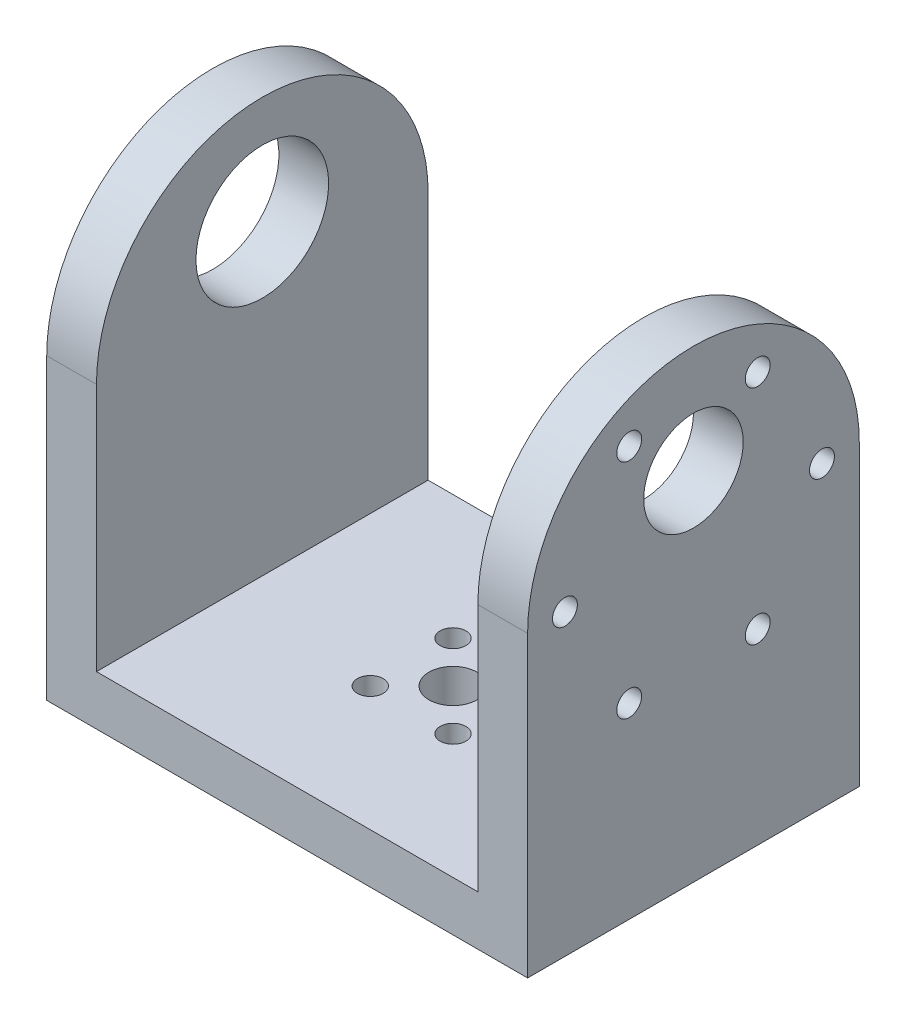
ISO-10303-21;
HEADER;
FILE_DESCRIPTION(('STEP AP214'),'2;1');
FILE_NAME('part.step','',(''),(''),'','','');
FILE_SCHEMA(('AUTOMOTIVE_DESIGN { 1 0 10303 214 1 1 1 1 }'));
ENDSEC;
DATA;
#1=APPLICATION_CONTEXT('core data for automotive mechanical design processes');
#2=APPLICATION_PROTOCOL_DEFINITION('international standard','automotive_design',2000,#1);
#3=PRODUCT_CONTEXT('',#1,'mechanical');
#4=PRODUCT('Part','Part','',(#3));
#5=PRODUCT_RELATED_PRODUCT_CATEGORY('part','',(#4));
#6=PRODUCT_DEFINITION_FORMATION('','',#4);
#7=PRODUCT_DEFINITION_CONTEXT('part definition',#1,'design');
#8=PRODUCT_DEFINITION('design','',#6,#7);
#9=PRODUCT_DEFINITION_SHAPE('','',#8);
#10=(LENGTH_UNIT() NAMED_UNIT(*) SI_UNIT(.MILLI.,.METRE.));
#11=(NAMED_UNIT(*) PLANE_ANGLE_UNIT() SI_UNIT($,.RADIAN.));
#12=(NAMED_UNIT(*) SI_UNIT($,.STERADIAN.) SOLID_ANGLE_UNIT());
#13=UNCERTAINTY_MEASURE_WITH_UNIT(LENGTH_MEASURE(1.E-05),#10,'distance_accuracy_value','');
#14=(GEOMETRIC_REPRESENTATION_CONTEXT(3) GLOBAL_UNCERTAINTY_ASSIGNED_CONTEXT((#13)) GLOBAL_UNIT_ASSIGNED_CONTEXT((#10,
#11,#12)) REPRESENTATION_CONTEXT('',''));
#15=CARTESIAN_POINT('',(0.,0.,0.));
#16=DIRECTION('',(0.,0.,1.));
#17=DIRECTION('',(1.,0.,0.));
#18=AXIS2_PLACEMENT_3D('',#15,#16,#17);
#19=CARTESIAN_POINT('',(0.,2.,0.));
#20=DIRECTION('',(0.,1.,0.));
#21=DIRECTION('',(0.,0.,1.));
#22=AXIS2_PLACEMENT_3D('',#19,#20,#21);
#23=PLANE('',#22);
#24=CARTESIAN_POINT('',(8.49,2.,-36.5807801762255));
#25=DIRECTION('',(0.,1.,0.));
#26=DIRECTION('',(0.,0.,1.));
#27=AXIS2_PLACEMENT_3D('',#24,#25,#26);
#28=CIRCLE('',#27,1.55);
#29=CARTESIAN_POINT('',(8.49,2.,-35.0307801762255));
#30=VERTEX_POINT('',#29);
#31=EDGE_CURVE('E136',#30,#30,#28,.T.);
#32=ORIENTED_EDGE('',*,*,#31,.F.);
#33=EDGE_LOOP('',(#32));
#34=FACE_BOUND('',#33,.T.);
#35=CARTESIAN_POINT('',(-1.49,2.,-36.5807801762255));
#36=DIRECTION('',(0.,1.,0.));
#37=DIRECTION('',(0.,0.,1.));
#38=AXIS2_PLACEMENT_3D('',#35,#36,#37);
#39=CIRCLE('',#38,1.55);
#40=CARTESIAN_POINT('',(-1.49,2.,-35.0307801762255));
#41=VERTEX_POINT('',#40);
#42=EDGE_CURVE('E141',#41,#41,#39,.T.);
#43=ORIENTED_EDGE('',*,*,#42,.F.);
#44=EDGE_LOOP('',(#43));
#45=FACE_BOUND('',#44,.T.);
#46=CARTESIAN_POINT('',(8.49,2.,-46.5607801762255));
#47=DIRECTION('',(0.,1.,0.));
#48=DIRECTION('',(0.,0.,1.));
#49=AXIS2_PLACEMENT_3D('',#46,#47,#48);
#50=CIRCLE('',#49,1.55);
#51=CARTESIAN_POINT('',(8.49,2.,-45.0107801762255));
#52=VERTEX_POINT('',#51);
#53=EDGE_CURVE('E154',#52,#52,#50,.T.);
#54=ORIENTED_EDGE('',*,*,#53,.F.);
#55=EDGE_LOOP('',(#54));
#56=FACE_BOUND('',#55,.T.);
#57=CARTESIAN_POINT('',(-1.49,2.,-46.5607801762255));
#58=DIRECTION('',(0.,1.,0.));
#59=DIRECTION('',(0.,0.,1.));
#60=AXIS2_PLACEMENT_3D('',#57,#58,#59);
#61=CIRCLE('',#60,1.55);
#62=CARTESIAN_POINT('',(-1.49,2.,-45.0107801762255));
#63=VERTEX_POINT('',#62);
#64=EDGE_CURVE('E149',#63,#63,#61,.T.);
#65=ORIENTED_EDGE('',*,*,#64,.F.);
#66=EDGE_LOOP('',(#65));
#67=FACE_BOUND('',#66,.T.);
#68=CARTESIAN_POINT('',(3.5,2.,-41.5707801762255));
#69=DIRECTION('',(0.,1.,0.));
#70=DIRECTION('',(0.,0.,1.));
#71=AXIS2_PLACEMENT_3D('',#68,#69,#70);
#72=CIRCLE('',#71,2.9);
#73=CARTESIAN_POINT('',(3.5,2.,-38.6707801762255));
#74=VERTEX_POINT('',#73);
#75=EDGE_CURVE('E153',#74,#74,#72,.T.);
#76=ORIENTED_EDGE('',*,*,#75,.F.);
#77=EDGE_LOOP('',(#76));
#78=FACE_BOUND('',#77,.T.);
#79=DIRECTION('',(1.,0.,0.));
#80=VECTOR('',#79,1.);
#81=CARTESIAN_POINT('',(-21.5,2.,-21.5707801762255));
#82=LINE('',#81,#80);
#83=CARTESIAN_POINT('',(-19.5,2.,-21.5707801762255));
#84=VERTEX_POINT('',#83);
#85=CARTESIAN_POINT('',(26.5,2.,-21.5707801762255));
#86=VERTEX_POINT('',#85);
#87=EDGE_CURVE('E63',#84,#86,#82,.T.);
#88=ORIENTED_EDGE('',*,*,#87,.T.);
#89=DIRECTION('',(0.,0.,-1.));
#90=VECTOR('',#89,1.);
#91=CARTESIAN_POINT('',(26.5,2.,0.));
#92=LINE('',#91,#90);
#93=CARTESIAN_POINT('',(26.5,2.,-61.5707801762255));
#94=VERTEX_POINT('',#93);
#95=EDGE_CURVE('E67',#86,#94,#92,.T.);
#96=ORIENTED_EDGE('',*,*,#95,.T.);
#97=DIRECTION('',(-1.,0.,0.));
#98=VECTOR('',#97,1.);
#99=CARTESIAN_POINT('',(-21.5,2.,-61.5707801762255));
#100=LINE('',#99,#98);
#101=CARTESIAN_POINT('',(-19.5,2.,-61.5707801762255));
#102=VERTEX_POINT('',#101);
#103=EDGE_CURVE('E251',#94,#102,#100,.T.);
#104=ORIENTED_EDGE('',*,*,#103,.T.);
#105=DIRECTION('',(0.,0.,1.));
#106=VECTOR('',#105,1.);
#107=CARTESIAN_POINT('',(-19.5,2.,-21.5707801762255));
#108=LINE('',#107,#106);
#109=EDGE_CURVE('E238',#102,#84,#108,.T.);
#110=ORIENTED_EDGE('',*,*,#109,.T.);
#111=EDGE_LOOP('',(#88,#96,#104,#110));
#112=FACE_BOUND('',#111,.T.);
#113=ADVANCED_FACE('F45',(#34,#45,#56,#67,#78,#112),#23,.T.);
#114=CARTESIAN_POINT('',(-21.5,-4.,-21.5707801762255));
#115=DIRECTION('',(0.,0.,1.));
#116=DIRECTION('',(1.,0.,0.));
#117=AXIS2_PLACEMENT_3D('',#114,#115,#116);
#118=PLANE('',#117);
#119=DIRECTION('',(1.,0.,0.));
#120=VECTOR('',#119,1.);
#121=CARTESIAN_POINT('',(-21.5,-4.,-21.5707801762255));
#122=LINE('',#121,#120);
#123=CARTESIAN_POINT('',(-25.5,-4.,-21.5707801762255));
#124=VERTEX_POINT('',#123);
#125=CARTESIAN_POINT('',(32.5,-4.,-21.5707801762255));
#126=VERTEX_POINT('',#125);
#127=EDGE_CURVE('E11',#124,#126,#122,.T.);
#128=ORIENTED_EDGE('',*,*,#127,.T.);
#129=DIRECTION('',(0.,-1.,0.));
#130=VECTOR('',#129,1.);
#131=CARTESIAN_POINT('',(32.5,-4.,-21.5707801762255));
#132=LINE('',#131,#130);
#133=CARTESIAN_POINT('',(32.5,32.,-21.5707801762255));
#134=VERTEX_POINT('',#133);
#135=EDGE_CURVE('E206',#134,#126,#132,.T.);
#136=ORIENTED_EDGE('',*,*,#135,.F.);
#137=DIRECTION('',(-1.,0.,0.));
#138=VECTOR('',#137,1.);
#139=CARTESIAN_POINT('',(32.5,32.,-21.5707801762255));
#140=LINE('',#139,#138);
#141=CARTESIAN_POINT('',(26.5,32.,-21.5707801762255));
#142=VERTEX_POINT('',#141);
#143=EDGE_CURVE('E218',#134,#142,#140,.T.);
#144=ORIENTED_EDGE('',*,*,#143,.T.);
#145=DIRECTION('',(0.,-1.,0.));
#146=VECTOR('',#145,1.);
#147=CARTESIAN_POINT('',(26.5,-4.,-21.5707801762255));
#148=LINE('',#147,#146);
#149=EDGE_CURVE('E195',#142,#86,#148,.T.);
#150=ORIENTED_EDGE('',*,*,#149,.T.);
#151=ORIENTED_EDGE('',*,*,#87,.F.);
#152=DIRECTION('',(0.,1.,0.));
#153=VECTOR('',#152,1.);
#154=CARTESIAN_POINT('',(-19.5,2.,-21.5707801762255));
#155=LINE('',#154,#153);
#156=CARTESIAN_POINT('',(-19.5,32.,-21.5707801762255));
#157=VERTEX_POINT('',#156);
#158=EDGE_CURVE('E227',#84,#157,#155,.T.);
#159=ORIENTED_EDGE('',*,*,#158,.T.);
#160=DIRECTION('',(1.,0.,0.));
#161=VECTOR('',#160,1.);
#162=CARTESIAN_POINT('',(-25.5,32.,-21.5707801762255));
#163=LINE('',#162,#161);
#164=CARTESIAN_POINT('',(-25.5,32.,-21.5707801762255));
#165=VERTEX_POINT('',#164);
#166=EDGE_CURVE('E248',#165,#157,#163,.T.);
#167=ORIENTED_EDGE('',*,*,#166,.F.);
#168=DIRECTION('',(0.,1.,0.));
#169=VECTOR('',#168,1.);
#170=CARTESIAN_POINT('',(-25.5,2.,-21.5707801762255));
#171=LINE('',#170,#169);
#172=EDGE_CURVE('E241',#124,#165,#171,.T.);
#173=ORIENTED_EDGE('',*,*,#172,.F.);
#174=EDGE_LOOP('',(#128,#136,#144,#150,#151,#159,#167,#173));
#175=FACE_BOUND('',#174,.T.);
#176=ADVANCED_FACE('F344',(#175),#118,.T.);
#177=CARTESIAN_POINT('',(-21.5,-4.,-61.5707801762255));
#178=DIRECTION('',(0.,0.,-1.));
#179=DIRECTION('',(-1.,0.,0.));
#180=AXIS2_PLACEMENT_3D('',#177,#178,#179);
#181=PLANE('',#180);
#182=DIRECTION('',(0.,-1.,0.));
#183=VECTOR('',#182,1.);
#184=CARTESIAN_POINT('',(-19.5,2.,-61.5707801762255));
#185=LINE('',#184,#183);
#186=CARTESIAN_POINT('',(-19.5,32.,-61.5707801762255));
#187=VERTEX_POINT('',#186);
#188=EDGE_CURVE('E235',#187,#102,#185,.T.);
#189=ORIENTED_EDGE('',*,*,#188,.T.);
#190=ORIENTED_EDGE('',*,*,#103,.F.);
#191=DIRECTION('',(0.,1.,0.));
#192=VECTOR('',#191,1.);
#193=CARTESIAN_POINT('',(26.5,-4.,-61.5707801762255));
#194=LINE('',#193,#192);
#195=CARTESIAN_POINT('',(26.5,32.,-61.5707801762255));
#196=VERTEX_POINT('',#195);
#197=EDGE_CURVE('E199',#94,#196,#194,.T.);
#198=ORIENTED_EDGE('',*,*,#197,.T.);
#199=DIRECTION('',(-1.,0.,0.));
#200=VECTOR('',#199,1.);
#201=CARTESIAN_POINT('',(32.5,32.,-61.5707801762255));
#202=LINE('',#201,#200);
#203=CARTESIAN_POINT('',(32.5,32.,-61.5707801762255));
#204=VERTEX_POINT('',#203);
#205=EDGE_CURVE('E221',#204,#196,#202,.T.);
#206=ORIENTED_EDGE('',*,*,#205,.F.);
#207=DIRECTION('',(0.,1.,0.));
#208=VECTOR('',#207,1.);
#209=CARTESIAN_POINT('',(32.5,-4.,-61.5707801762255));
#210=LINE('',#209,#208);
#211=CARTESIAN_POINT('',(32.5,-4.,-61.5707801762255));
#212=VERTEX_POINT('',#211);
#213=EDGE_CURVE('E115',#212,#204,#210,.T.);
#214=ORIENTED_EDGE('',*,*,#213,.F.);
#215=DIRECTION('',(-1.,0.,0.));
#216=VECTOR('',#215,1.);
#217=CARTESIAN_POINT('',(-21.5,-4.,-61.5707801762255));
#218=LINE('',#217,#216);
#219=CARTESIAN_POINT('',(-25.5,-4.,-61.5707801762255));
#220=VERTEX_POINT('',#219);
#221=EDGE_CURVE('E55',#212,#220,#218,.T.);
#222=ORIENTED_EDGE('',*,*,#221,.T.);
#223=DIRECTION('',(0.,-1.,0.));
#224=VECTOR('',#223,1.);
#225=CARTESIAN_POINT('',(-25.5,2.,-61.5707801762255));
#226=LINE('',#225,#224);
#227=CARTESIAN_POINT('',(-25.5,32.,-61.5707801762255));
#228=VERTEX_POINT('',#227);
#229=EDGE_CURVE('E113',#228,#220,#226,.T.);
#230=ORIENTED_EDGE('',*,*,#229,.F.);
#231=DIRECTION('',(1.,0.,0.));
#232=VECTOR('',#231,1.);
#233=CARTESIAN_POINT('',(-25.5,32.,-61.5707801762255));
#234=LINE('',#233,#232);
#235=EDGE_CURVE('E130',#228,#187,#234,.T.);
#236=ORIENTED_EDGE('',*,*,#235,.T.);
#237=EDGE_LOOP('',(#189,#190,#198,#206,#214,#222,#230,#236));
#238=FACE_BOUND('',#237,.T.);
#239=ADVANCED_FACE('F47',(#238),#181,.T.);
#240=CARTESIAN_POINT('',(0.,-4.,0.));
#241=DIRECTION('',(0.,1.,0.));
#242=DIRECTION('',(0.,0.,1.));
#243=AXIS2_PLACEMENT_3D('',#240,#241,#242);
#244=PLANE('',#243);
#245=DIRECTION('',(0.,0.,1.));
#246=VECTOR('',#245,1.);
#247=CARTESIAN_POINT('',(-25.5,-4.,-61.5707801762255));
#248=LINE('',#247,#246);
#249=EDGE_CURVE('E126',#220,#124,#248,.T.);
#250=ORIENTED_EDGE('',*,*,#249,.F.);
#251=ORIENTED_EDGE('',*,*,#221,.F.);
#252=DIRECTION('',(0.,0.,-1.));
#253=VECTOR('',#252,1.);
#254=CARTESIAN_POINT('',(32.5,-4.,-21.5707801762255));
#255=LINE('',#254,#253);
#256=EDGE_CURVE('E210',#126,#212,#255,.T.);
#257=ORIENTED_EDGE('',*,*,#256,.F.);
#258=ORIENTED_EDGE('',*,*,#127,.F.);
#259=EDGE_LOOP('',(#250,#251,#257,#258));
#260=FACE_BOUND('',#259,.T.);
#261=CARTESIAN_POINT('',(3.5,-4.,-41.5707801762255));
#262=DIRECTION('',(0.,1.,0.));
#263=DIRECTION('',(0.,0.,1.));
#264=AXIS2_PLACEMENT_3D('',#261,#262,#263);
#265=CIRCLE('',#264,2.9);
#266=CARTESIAN_POINT('',(3.5,-4.,-38.6707801762255));
#267=VERTEX_POINT('',#266);
#268=EDGE_CURVE('E164',#267,#267,#265,.T.);
#269=ORIENTED_EDGE('',*,*,#268,.T.);
#270=EDGE_LOOP('',(#269));
#271=FACE_BOUND('',#270,.T.);
#272=CARTESIAN_POINT('',(-1.49,-4.,-46.5607801762255));
#273=DIRECTION('',(0.,1.,0.));
#274=DIRECTION('',(0.,0.,1.));
#275=AXIS2_PLACEMENT_3D('',#272,#273,#274);
#276=CIRCLE('',#275,1.55);
#277=CARTESIAN_POINT('',(-1.49,-4.,-45.0107801762255));
#278=VERTEX_POINT('',#277);
#279=EDGE_CURVE('E262',#278,#278,#276,.T.);
#280=ORIENTED_EDGE('',*,*,#279,.T.);
#281=EDGE_LOOP('',(#280));
#282=FACE_BOUND('',#281,.T.);
#283=CARTESIAN_POINT('',(8.49,-4.,-46.5607801762255));
#284=DIRECTION('',(0.,1.,0.));
#285=DIRECTION('',(0.,0.,1.));
#286=AXIS2_PLACEMENT_3D('',#283,#284,#285);
#287=CIRCLE('',#286,1.55);
#288=CARTESIAN_POINT('',(8.49,-4.,-45.0107801762255));
#289=VERTEX_POINT('',#288);
#290=EDGE_CURVE('E266',#289,#289,#287,.T.);
#291=ORIENTED_EDGE('',*,*,#290,.T.);
#292=EDGE_LOOP('',(#291));
#293=FACE_BOUND('',#292,.T.);
#294=CARTESIAN_POINT('',(-1.49,-4.,-36.5807801762255));
#295=DIRECTION('',(0.,1.,0.));
#296=DIRECTION('',(0.,0.,1.));
#297=AXIS2_PLACEMENT_3D('',#294,#295,#296);
#298=CIRCLE('',#297,1.55);
#299=CARTESIAN_POINT('',(-1.49,-4.,-35.0307801762255));
#300=VERTEX_POINT('',#299);
#301=EDGE_CURVE('E270',#300,#300,#298,.T.);
#302=ORIENTED_EDGE('',*,*,#301,.T.);
#303=EDGE_LOOP('',(#302));
#304=FACE_BOUND('',#303,.T.);
#305=CARTESIAN_POINT('',(8.49,-4.,-36.5807801762255));
#306=DIRECTION('',(0.,1.,0.));
#307=DIRECTION('',(0.,0.,1.));
#308=AXIS2_PLACEMENT_3D('',#305,#306,#307);
#309=CIRCLE('',#308,1.55);
#310=CARTESIAN_POINT('',(8.49,-4.,-35.0307801762255));
#311=VERTEX_POINT('',#310);
#312=EDGE_CURVE('E170',#311,#311,#309,.T.);
#313=ORIENTED_EDGE('',*,*,#312,.T.);
#314=EDGE_LOOP('',(#313));
#315=FACE_BOUND('',#314,.T.);
#316=ADVANCED_FACE('F132',(#260,#271,#282,#293,#304,#315),#244,.F.);
#317=CARTESIAN_POINT('',(-25.5,32.,-41.5707801762255));
#318=DIRECTION('',(1.,0.,0.));
#319=DIRECTION('',(0.,0.,-1.));
#320=AXIS2_PLACEMENT_3D('',#317,#318,#319);
#321=CYLINDRICAL_SURFACE('',#320,20.);
#322=ORIENTED_EDGE('',*,*,#166,.T.);
#323=CARTESIAN_POINT('',(-19.5,32.,-41.5707801762255));
#324=DIRECTION('',(-1.,0.,0.));
#325=DIRECTION('',(0.,0.,1.));
#326=AXIS2_PLACEMENT_3D('',#323,#324,#325);
#327=CIRCLE('',#326,20.);
#328=EDGE_CURVE('E231',#157,#187,#327,.T.);
#329=ORIENTED_EDGE('',*,*,#328,.T.);
#330=ORIENTED_EDGE('',*,*,#235,.F.);
#331=CARTESIAN_POINT('',(-25.5,32.,-41.5707801762255));
#332=DIRECTION('',(-1.,0.,0.));
#333=DIRECTION('',(0.,0.,1.));
#334=AXIS2_PLACEMENT_3D('',#331,#332,#333);
#335=CIRCLE('',#334,20.);
#336=EDGE_CURVE('E127',#165,#228,#335,.T.);
#337=ORIENTED_EDGE('',*,*,#336,.F.);
#338=EDGE_LOOP('',(#322,#329,#330,#337));
#339=FACE_BOUND('',#338,.T.);
#340=ADVANCED_FACE('F357',(#339),#321,.T.);
#341=CARTESIAN_POINT('',(-25.5,32.,-41.5707801762255));
#342=DIRECTION('',(-1.,0.,0.));
#343=DIRECTION('',(0.,0.,1.));
#344=AXIS2_PLACEMENT_3D('',#341,#342,#343);
#345=PLANE('',#344);
#346=CARTESIAN_POINT('',(-25.5,39.,-41.5707801762255));
#347=DIRECTION('',(-1.,0.,0.));
#348=DIRECTION('',(0.,0.,1.));
#349=AXIS2_PLACEMENT_3D('',#346,#347,#348);
#350=CIRCLE('',#349,8.);
#351=CARTESIAN_POINT('',(-25.5,39.,-33.5707801762255));
#352=VERTEX_POINT('',#351);
#353=EDGE_CURVE('E459',#352,#352,#350,.T.);
#354=ORIENTED_EDGE('',*,*,#353,.F.);
#355=EDGE_LOOP('',(#354));
#356=FACE_BOUND('',#355,.T.);
#357=ORIENTED_EDGE('',*,*,#172,.T.);
#358=ORIENTED_EDGE('',*,*,#336,.T.);
#359=ORIENTED_EDGE('',*,*,#229,.T.);
#360=ORIENTED_EDGE('',*,*,#249,.T.);
#361=EDGE_LOOP('',(#357,#358,#359,#360));
#362=FACE_BOUND('',#361,.T.);
#363=ADVANCED_FACE('F125',(#356,#362),#345,.T.);
#364=CARTESIAN_POINT('',(-19.5,32.,-41.5707801762255));
#365=DIRECTION('',(-1.,0.,0.));
#366=DIRECTION('',(0.,0.,1.));
#367=AXIS2_PLACEMENT_3D('',#364,#365,#366);
#368=PLANE('',#367);
#369=CARTESIAN_POINT('',(-19.5,39.,-41.5707801762255));
#370=DIRECTION('',(-1.,0.,0.));
#371=DIRECTION('',(0.,0.,1.));
#372=AXIS2_PLACEMENT_3D('',#369,#370,#371);
#373=CIRCLE('',#372,8.);
#374=CARTESIAN_POINT('',(-19.5,39.,-33.5707801762255));
#375=VERTEX_POINT('',#374);
#376=EDGE_CURVE('E455',#375,#375,#373,.T.);
#377=ORIENTED_EDGE('',*,*,#376,.T.);
#378=EDGE_LOOP('',(#377));
#379=FACE_BOUND('',#378,.T.);
#380=ORIENTED_EDGE('',*,*,#158,.F.);
#381=ORIENTED_EDGE('',*,*,#109,.F.);
#382=ORIENTED_EDGE('',*,*,#188,.F.);
#383=ORIENTED_EDGE('',*,*,#328,.F.);
#384=EDGE_LOOP('',(#380,#381,#382,#383));
#385=FACE_BOUND('',#384,.T.);
#386=ADVANCED_FACE('F353',(#379,#385),#368,.F.);
#387=CARTESIAN_POINT('',(32.5,32.,-41.5707801762255));
#388=DIRECTION('',(-1.,0.,0.));
#389=DIRECTION('',(0.,0.,1.));
#390=AXIS2_PLACEMENT_3D('',#387,#388,#389);
#391=CYLINDRICAL_SURFACE('',#390,20.);
#392=ORIENTED_EDGE('',*,*,#205,.T.);
#393=CARTESIAN_POINT('',(26.5,32.,-41.5707801762255));
#394=DIRECTION('',(1.,0.,0.));
#395=DIRECTION('',(0.,0.,-1.));
#396=AXIS2_PLACEMENT_3D('',#393,#394,#395);
#397=CIRCLE('',#396,20.);
#398=EDGE_CURVE('E202',#196,#142,#397,.T.);
#399=ORIENTED_EDGE('',*,*,#398,.T.);
#400=ORIENTED_EDGE('',*,*,#143,.F.);
#401=CARTESIAN_POINT('',(32.5,32.,-41.5707801762255));
#402=DIRECTION('',(1.,0.,0.));
#403=DIRECTION('',(0.,0.,-1.));
#404=AXIS2_PLACEMENT_3D('',#401,#402,#403);
#405=CIRCLE('',#404,20.);
#406=EDGE_CURVE('E215',#204,#134,#405,.T.);
#407=ORIENTED_EDGE('',*,*,#406,.F.);
#408=EDGE_LOOP('',(#392,#399,#400,#407));
#409=FACE_BOUND('',#408,.T.);
#410=ADVANCED_FACE('F349',(#409),#391,.T.);
#411=CARTESIAN_POINT('',(32.5,32.,-41.5707801762255));
#412=DIRECTION('',(1.,0.,0.));
#413=DIRECTION('',(0.,0.,-1.));
#414=AXIS2_PLACEMENT_3D('',#411,#412,#413);
#415=PLANE('',#414);
#416=CARTESIAN_POINT('',(32.5,32.,-26.0707801762255));
#417=DIRECTION('',(1.,0.,0.));
#418=DIRECTION('',(0.,0.,-1.));
#419=AXIS2_PLACEMENT_3D('',#416,#417,#418);
#420=CIRCLE('',#419,1.5);
#421=CARTESIAN_POINT('',(32.5,32.,-27.5707801762255));
#422=VERTEX_POINT('',#421);
#423=EDGE_CURVE('E191',#422,#422,#420,.F.);
#424=ORIENTED_EDGE('',*,*,#423,.T.);
#425=EDGE_LOOP('',(#424));
#426=FACE_BOUND('',#425,.T.);
#427=CARTESIAN_POINT('',(32.5,39.,-41.5707801762255));
#428=DIRECTION('',(1.,0.,0.));
#429=DIRECTION('',(0.,0.,-1.));
#430=AXIS2_PLACEMENT_3D('',#427,#428,#429);
#431=CIRCLE('',#430,6.);
#432=CARTESIAN_POINT('',(32.5,39.,-47.5707801762255));
#433=VERTEX_POINT('',#432);
#434=EDGE_CURVE('E187',#433,#433,#431,.F.);
#435=ORIENTED_EDGE('',*,*,#434,.T.);
#436=EDGE_LOOP('',(#435));
#437=FACE_BOUND('',#436,.T.);
#438=CARTESIAN_POINT('',(32.5,45.4233937586588,-33.8207801762254));
#439=DIRECTION('',(1.,0.,0.));
#440=DIRECTION('',(0.,0.,-1.));
#441=AXIS2_PLACEMENT_3D('',#438,#439,#440);
#442=CIRCLE('',#441,1.5);
#443=CARTESIAN_POINT('',(32.5,45.4233937586588,-35.3207801762254));
#444=VERTEX_POINT('',#443);
#445=EDGE_CURVE('E182',#444,#444,#442,.F.);
#446=ORIENTED_EDGE('',*,*,#445,.T.);
#447=EDGE_LOOP('',(#446));
#448=FACE_BOUND('',#447,.T.);
#449=CARTESIAN_POINT('',(32.5,45.4233937586589,-49.3207801762254));
#450=DIRECTION('',(1.,0.,0.));
#451=DIRECTION('',(0.,0.,-1.));
#452=AXIS2_PLACEMENT_3D('',#449,#450,#451);
#453=CIRCLE('',#452,1.5);
#454=CARTESIAN_POINT('',(32.5,45.4233937586589,-50.8207801762254));
#455=VERTEX_POINT('',#454);
#456=EDGE_CURVE('E178',#455,#455,#453,.F.);
#457=ORIENTED_EDGE('',*,*,#456,.T.);
#458=EDGE_LOOP('',(#457));
#459=FACE_BOUND('',#458,.T.);
#460=CARTESIAN_POINT('',(32.5,32.0000000000001,-57.0707801762254));
#461=DIRECTION('',(1.,0.,0.));
#462=DIRECTION('',(0.,0.,-1.));
#463=AXIS2_PLACEMENT_3D('',#460,#461,#462);
#464=CIRCLE('',#463,1.5);
#465=CARTESIAN_POINT('',(32.5,32.0000000000001,-58.5707801762254));
#466=VERTEX_POINT('',#465);
#467=EDGE_CURVE('E174',#466,#466,#464,.F.);
#468=ORIENTED_EDGE('',*,*,#467,.T.);
#469=EDGE_LOOP('',(#468));
#470=FACE_BOUND('',#469,.T.);
#471=CARTESIAN_POINT('',(32.5,18.5766062413413,-49.3207801762255));
#472=DIRECTION('',(1.,0.,0.));
#473=DIRECTION('',(0.,0.,-1.));
#474=AXIS2_PLACEMENT_3D('',#471,#472,#473);
#475=CIRCLE('',#474,1.5);
#476=CARTESIAN_POINT('',(32.5,18.5766062413413,-50.8207801762255));
#477=VERTEX_POINT('',#476);
#478=EDGE_CURVE('E169',#477,#477,#475,.F.);
#479=ORIENTED_EDGE('',*,*,#478,.T.);
#480=EDGE_LOOP('',(#479));
#481=FACE_BOUND('',#480,.T.);
#482=CARTESIAN_POINT('',(32.5,18.5766062413413,-33.8207801762256));
#483=DIRECTION('',(1.,0.,0.));
#484=DIRECTION('',(0.,0.,-1.));
#485=AXIS2_PLACEMENT_3D('',#482,#483,#484);
#486=CIRCLE('',#485,1.5);
#487=CARTESIAN_POINT('',(32.5,18.5766062413413,-35.3207801762256));
#488=VERTEX_POINT('',#487);
#489=EDGE_CURVE('E165',#488,#488,#486,.F.);
#490=ORIENTED_EDGE('',*,*,#489,.T.);
#491=EDGE_LOOP('',(#490));
#492=FACE_BOUND('',#491,.T.);
#493=ORIENTED_EDGE('',*,*,#135,.T.);
#494=ORIENTED_EDGE('',*,*,#256,.T.);
#495=ORIENTED_EDGE('',*,*,#213,.T.);
#496=ORIENTED_EDGE('',*,*,#406,.T.);
#497=EDGE_LOOP('',(#493,#494,#495,#496));
#498=FACE_BOUND('',#497,.T.);
#499=ADVANCED_FACE('F327',(#426,#437,#448,#459,#470,#481,#492,#498),#415,.T.);
#500=CARTESIAN_POINT('',(26.5,32.,-41.5707801762255));
#501=DIRECTION('',(1.,0.,0.));
#502=DIRECTION('',(0.,0.,-1.));
#503=AXIS2_PLACEMENT_3D('',#500,#501,#502);
#504=PLANE('',#503);
#505=CARTESIAN_POINT('',(26.5,32.,-26.0707801762255));
#506=DIRECTION('',(1.,0.,0.));
#507=DIRECTION('',(0.,0.,-1.));
#508=AXIS2_PLACEMENT_3D('',#505,#506,#507);
#509=CIRCLE('',#508,2.3132024345402);
#510=CARTESIAN_POINT('',(26.5,32.,-28.3839826107657));
#511=VERTEX_POINT('',#510);
#512=EDGE_CURVE('E49',#511,#511,#509,.F.);
#513=ORIENTED_EDGE('',*,*,#512,.F.);
#514=EDGE_LOOP('',(#513));
#515=FACE_BOUND('',#514,.T.);
#516=CARTESIAN_POINT('',(26.5,18.5766062413413,-33.8207801762254));
#517=DIRECTION('',(1.,0.,0.));
#518=DIRECTION('',(0.,0.,-1.));
#519=AXIS2_PLACEMENT_3D('',#516,#517,#518);
#520=CIRCLE('',#519,2.31320243454021);
#521=CARTESIAN_POINT('',(26.5,18.5766062413413,-36.1339826107656));
#522=VERTEX_POINT('',#521);
#523=EDGE_CURVE('E144',#522,#522,#520,.F.);
#524=ORIENTED_EDGE('',*,*,#523,.F.);
#525=EDGE_LOOP('',(#524));
#526=FACE_BOUND('',#525,.T.);
#527=CARTESIAN_POINT('',(26.5,18.5766062413411,-49.3207801762254));
#528=DIRECTION('',(1.,0.,0.));
#529=DIRECTION('',(0.,0.,-1.));
#530=AXIS2_PLACEMENT_3D('',#527,#528,#529);
#531=CIRCLE('',#530,2.3132024345402);
#532=CARTESIAN_POINT('',(26.5,18.5766062413411,-51.6339826107656));
#533=VERTEX_POINT('',#532);
#534=EDGE_CURVE('E314',#533,#533,#531,.F.);
#535=ORIENTED_EDGE('',*,*,#534,.F.);
#536=EDGE_LOOP('',(#535));
#537=FACE_BOUND('',#536,.T.);
#538=CARTESIAN_POINT('',(26.5,31.9999999999999,-57.0707801762255));
#539=DIRECTION('',(1.,0.,0.));
#540=DIRECTION('',(0.,0.,-1.));
#541=AXIS2_PLACEMENT_3D('',#538,#539,#540);
#542=CIRCLE('',#541,2.31320243454021);
#543=CARTESIAN_POINT('',(26.5,31.9999999999999,-59.3839826107657));
#544=VERTEX_POINT('',#543);
#545=EDGE_CURVE('E310',#544,#544,#542,.F.);
#546=ORIENTED_EDGE('',*,*,#545,.F.);
#547=EDGE_LOOP('',(#546));
#548=FACE_BOUND('',#547,.T.);
#549=CARTESIAN_POINT('',(26.5,45.4233937586587,-49.3207801762256));
#550=DIRECTION('',(1.,0.,0.));
#551=DIRECTION('',(0.,0.,-1.));
#552=AXIS2_PLACEMENT_3D('',#549,#550,#551);
#553=CIRCLE('',#552,2.3132024345402);
#554=CARTESIAN_POINT('',(26.5,45.4233937586587,-51.6339826107658));
#555=VERTEX_POINT('',#554);
#556=EDGE_CURVE('E306',#555,#555,#553,.F.);
#557=ORIENTED_EDGE('',*,*,#556,.F.);
#558=EDGE_LOOP('',(#557));
#559=FACE_BOUND('',#558,.T.);
#560=CARTESIAN_POINT('',(26.5,45.4233937586588,-33.8207801762255));
#561=DIRECTION('',(1.,0.,0.));
#562=DIRECTION('',(0.,0.,-1.));
#563=AXIS2_PLACEMENT_3D('',#560,#561,#562);
#564=CIRCLE('',#563,2.3132024345402);
#565=CARTESIAN_POINT('',(26.5,45.4233937586588,-36.1339826107658));
#566=VERTEX_POINT('',#565);
#567=EDGE_CURVE('E302',#566,#566,#564,.F.);
#568=ORIENTED_EDGE('',*,*,#567,.F.);
#569=EDGE_LOOP('',(#568));
#570=FACE_BOUND('',#569,.T.);
#571=CARTESIAN_POINT('',(26.5,39.,-41.5707801762255));
#572=DIRECTION('',(1.,0.,0.));
#573=DIRECTION('',(0.,0.,-1.));
#574=AXIS2_PLACEMENT_3D('',#571,#572,#573);
#575=CIRCLE('',#574,6.);
#576=CARTESIAN_POINT('',(26.5,39.,-47.5707801762255));
#577=VERTEX_POINT('',#576);
#578=EDGE_CURVE('E186',#577,#577,#575,.F.);
#579=ORIENTED_EDGE('',*,*,#578,.F.);
#580=EDGE_LOOP('',(#579));
#581=FACE_BOUND('',#580,.T.);
#582=ORIENTED_EDGE('',*,*,#95,.F.);
#583=ORIENTED_EDGE('',*,*,#149,.F.);
#584=ORIENTED_EDGE('',*,*,#398,.F.);
#585=ORIENTED_EDGE('',*,*,#197,.F.);
#586=EDGE_LOOP('',(#582,#583,#584,#585));
#587=FACE_BOUND('',#586,.T.);
#588=ADVANCED_FACE('F323',(#515,#526,#537,#548,#559,#570,#581,#587),#504,.F.);
#589=CARTESIAN_POINT('',(-31.5,18.5766062413413,-33.8207801762256));
#590=DIRECTION('',(1.,0.,0.));
#591=DIRECTION('',(0.,0.,-1.));
#592=AXIS2_PLACEMENT_3D('',#589,#590,#591);
#593=CYLINDRICAL_SURFACE('',#592,1.5);
#594=CARTESIAN_POINT('',(28.5,18.5766062413413,-33.8207801762256));
#595=DIRECTION('',(1.,0.,0.));
#596=DIRECTION('',(0.,0.,-1.));
#597=AXIS2_PLACEMENT_3D('',#594,#595,#596);
#598=CIRCLE('',#597,1.5);
#599=CARTESIAN_POINT('',(28.5,18.5766062413413,-35.3207801762256));
#600=VERTEX_POINT('',#599);
#601=EDGE_CURVE('E298',#600,#600,#598,.T.);
#602=ORIENTED_EDGE('',*,*,#601,.F.);
#603=EDGE_LOOP('',(#602));
#604=FACE_BOUND('',#603,.T.);
#605=ORIENTED_EDGE('',*,*,#489,.F.);
#606=EDGE_LOOP('',(#605));
#607=FACE_BOUND('',#606,.T.);
#608=ADVANCED_FACE('F326',(#604,#607),#593,.F.);
#609=CARTESIAN_POINT('',(-31.5,18.5766062413413,-49.3207801762255));
#610=DIRECTION('',(1.,0.,0.));
#611=DIRECTION('',(0.,0.,-1.));
#612=AXIS2_PLACEMENT_3D('',#609,#610,#611);
#613=CYLINDRICAL_SURFACE('',#612,1.5);
#614=CARTESIAN_POINT('',(28.5,18.5766062413413,-49.3207801762255));
#615=DIRECTION('',(1.,0.,0.));
#616=DIRECTION('',(0.,0.,-1.));
#617=AXIS2_PLACEMENT_3D('',#614,#615,#616);
#618=CIRCLE('',#617,1.5);
#619=CARTESIAN_POINT('',(28.5,18.5766062413413,-50.8207801762255));
#620=VERTEX_POINT('',#619);
#621=EDGE_CURVE('E294',#620,#620,#618,.T.);
#622=ORIENTED_EDGE('',*,*,#621,.F.);
#623=EDGE_LOOP('',(#622));
#624=FACE_BOUND('',#623,.T.);
#625=ORIENTED_EDGE('',*,*,#478,.F.);
#626=EDGE_LOOP('',(#625));
#627=FACE_BOUND('',#626,.T.);
#628=ADVANCED_FACE('F432',(#624,#627),#613,.F.);
#629=CARTESIAN_POINT('',(-31.5,32.0000000000001,-57.0707801762254));
#630=DIRECTION('',(1.,0.,0.));
#631=DIRECTION('',(0.,0.,-1.));
#632=AXIS2_PLACEMENT_3D('',#629,#630,#631);
#633=CYLINDRICAL_SURFACE('',#632,1.5);
#634=CARTESIAN_POINT('',(28.5,32.0000000000001,-57.0707801762254));
#635=DIRECTION('',(1.,0.,0.));
#636=DIRECTION('',(0.,0.,-1.));
#637=AXIS2_PLACEMENT_3D('',#634,#635,#636);
#638=CIRCLE('',#637,1.5);
#639=CARTESIAN_POINT('',(28.5,32.0000000000001,-58.5707801762254));
#640=VERTEX_POINT('',#639);
#641=EDGE_CURVE('E290',#640,#640,#638,.T.);
#642=ORIENTED_EDGE('',*,*,#641,.F.);
#643=EDGE_LOOP('',(#642));
#644=FACE_BOUND('',#643,.T.);
#645=ORIENTED_EDGE('',*,*,#467,.F.);
#646=EDGE_LOOP('',(#645));
#647=FACE_BOUND('',#646,.T.);
#648=ADVANCED_FACE('F436',(#644,#647),#633,.F.);
#649=CARTESIAN_POINT('',(-31.5,45.4233937586589,-49.3207801762254));
#650=DIRECTION('',(1.,0.,0.));
#651=DIRECTION('',(0.,0.,-1.));
#652=AXIS2_PLACEMENT_3D('',#649,#650,#651);
#653=CYLINDRICAL_SURFACE('',#652,1.5);
#654=CARTESIAN_POINT('',(28.5,45.4233937586589,-49.3207801762254));
#655=DIRECTION('',(1.,0.,0.));
#656=DIRECTION('',(0.,0.,-1.));
#657=AXIS2_PLACEMENT_3D('',#654,#655,#656);
#658=CIRCLE('',#657,1.5);
#659=CARTESIAN_POINT('',(28.5,45.4233937586589,-50.8207801762254));
#660=VERTEX_POINT('',#659);
#661=EDGE_CURVE('E286',#660,#660,#658,.T.);
#662=ORIENTED_EDGE('',*,*,#661,.F.);
#663=EDGE_LOOP('',(#662));
#664=FACE_BOUND('',#663,.T.);
#665=ORIENTED_EDGE('',*,*,#456,.F.);
#666=EDGE_LOOP('',(#665));
#667=FACE_BOUND('',#666,.T.);
#668=ADVANCED_FACE('F426',(#664,#667),#653,.F.);
#669=CARTESIAN_POINT('',(-31.5,45.4233937586588,-33.8207801762254));
#670=DIRECTION('',(1.,0.,0.));
#671=DIRECTION('',(0.,0.,-1.));
#672=AXIS2_PLACEMENT_3D('',#669,#670,#671);
#673=CYLINDRICAL_SURFACE('',#672,1.5);
#674=CARTESIAN_POINT('',(28.5,45.4233937586588,-33.8207801762254));
#675=DIRECTION('',(1.,0.,0.));
#676=DIRECTION('',(0.,0.,-1.));
#677=AXIS2_PLACEMENT_3D('',#674,#675,#676);
#678=CIRCLE('',#677,1.5);
#679=CARTESIAN_POINT('',(28.5,45.4233937586588,-35.3207801762254));
#680=VERTEX_POINT('',#679);
#681=EDGE_CURVE('E281',#680,#680,#678,.T.);
#682=ORIENTED_EDGE('',*,*,#681,.F.);
#683=EDGE_LOOP('',(#682));
#684=FACE_BOUND('',#683,.T.);
#685=ORIENTED_EDGE('',*,*,#445,.F.);
#686=EDGE_LOOP('',(#685));
#687=FACE_BOUND('',#686,.T.);
#688=ADVANCED_FACE('F423',(#684,#687),#673,.F.);
#689=CARTESIAN_POINT('',(-31.5,39.,-41.5707801762255));
#690=DIRECTION('',(1.,0.,0.));
#691=DIRECTION('',(0.,0.,-1.));
#692=AXIS2_PLACEMENT_3D('',#689,#690,#691);
#693=CYLINDRICAL_SURFACE('',#692,6.);
#694=ORIENTED_EDGE('',*,*,#434,.F.);
#695=EDGE_LOOP('',(#694));
#696=FACE_BOUND('',#695,.T.);
#697=ORIENTED_EDGE('',*,*,#578,.T.);
#698=EDGE_LOOP('',(#697));
#699=FACE_BOUND('',#698,.T.);
#700=ADVANCED_FACE('F421',(#696,#699),#693,.F.);
#701=CARTESIAN_POINT('',(-31.5,32.,-26.0707801762255));
#702=DIRECTION('',(1.,0.,0.));
#703=DIRECTION('',(0.,0.,-1.));
#704=AXIS2_PLACEMENT_3D('',#701,#702,#703);
#705=CYLINDRICAL_SURFACE('',#704,1.5);
#706=CARTESIAN_POINT('',(28.5,32.,-26.0707801762255));
#707=DIRECTION('',(1.,0.,0.));
#708=DIRECTION('',(0.,0.,-1.));
#709=AXIS2_PLACEMENT_3D('',#706,#707,#708);
#710=CIRCLE('',#709,1.5);
#711=CARTESIAN_POINT('',(28.5,32.,-27.5707801762255));
#712=VERTEX_POINT('',#711);
#713=EDGE_CURVE('E277',#712,#712,#710,.T.);
#714=ORIENTED_EDGE('',*,*,#713,.F.);
#715=EDGE_LOOP('',(#714));
#716=FACE_BOUND('',#715,.T.);
#717=ORIENTED_EDGE('',*,*,#423,.F.);
#718=EDGE_LOOP('',(#717));
#719=FACE_BOUND('',#718,.T.);
#720=ADVANCED_FACE('F389',(#716,#719),#705,.F.);
#721=CARTESIAN_POINT('',(3.5,-90.,-41.5707801762255));
#722=DIRECTION('',(0.,1.,0.));
#723=DIRECTION('',(0.,0.,1.));
#724=AXIS2_PLACEMENT_3D('',#721,#722,#723);
#725=CYLINDRICAL_SURFACE('',#724,2.9);
#726=ORIENTED_EDGE('',*,*,#75,.T.);
#727=EDGE_LOOP('',(#726));
#728=FACE_BOUND('',#727,.T.);
#729=ORIENTED_EDGE('',*,*,#268,.F.);
#730=EDGE_LOOP('',(#729));
#731=FACE_BOUND('',#730,.T.);
#732=ADVANCED_FACE('F386',(#728,#731),#725,.F.);
#733=CARTESIAN_POINT('',(-1.49,-90.,-46.5607801762255));
#734=DIRECTION('',(0.,1.,0.));
#735=DIRECTION('',(0.,0.,1.));
#736=AXIS2_PLACEMENT_3D('',#733,#734,#735);
#737=CYLINDRICAL_SURFACE('',#736,1.55);
#738=ORIENTED_EDGE('',*,*,#64,.T.);
#739=EDGE_LOOP('',(#738));
#740=FACE_BOUND('',#739,.T.);
#741=ORIENTED_EDGE('',*,*,#279,.F.);
#742=EDGE_LOOP('',(#741));
#743=FACE_BOUND('',#742,.T.);
#744=ADVANCED_FACE('F388',(#740,#743),#737,.F.);
#745=CARTESIAN_POINT('',(8.49,-90.,-46.5607801762255));
#746=DIRECTION('',(0.,1.,0.));
#747=DIRECTION('',(0.,0.,1.));
#748=AXIS2_PLACEMENT_3D('',#745,#746,#747);
#749=CYLINDRICAL_SURFACE('',#748,1.55);
#750=ORIENTED_EDGE('',*,*,#53,.T.);
#751=EDGE_LOOP('',(#750));
#752=FACE_BOUND('',#751,.T.);
#753=ORIENTED_EDGE('',*,*,#290,.F.);
#754=EDGE_LOOP('',(#753));
#755=FACE_BOUND('',#754,.T.);
#756=ADVANCED_FACE('F414',(#752,#755),#749,.F.);
#757=CARTESIAN_POINT('',(-1.49,-90.,-36.5807801762255));
#758=DIRECTION('',(0.,1.,0.));
#759=DIRECTION('',(0.,0.,1.));
#760=AXIS2_PLACEMENT_3D('',#757,#758,#759);
#761=CYLINDRICAL_SURFACE('',#760,1.55);
#762=ORIENTED_EDGE('',*,*,#42,.T.);
#763=EDGE_LOOP('',(#762));
#764=FACE_BOUND('',#763,.T.);
#765=ORIENTED_EDGE('',*,*,#301,.F.);
#766=EDGE_LOOP('',(#765));
#767=FACE_BOUND('',#766,.T.);
#768=ADVANCED_FACE('F404',(#764,#767),#761,.F.);
#769=CARTESIAN_POINT('',(8.49,-90.,-36.5807801762255));
#770=DIRECTION('',(0.,1.,0.));
#771=DIRECTION('',(0.,0.,1.));
#772=AXIS2_PLACEMENT_3D('',#769,#770,#771);
#773=CYLINDRICAL_SURFACE('',#772,1.55);
#774=ORIENTED_EDGE('',*,*,#31,.T.);
#775=EDGE_LOOP('',(#774));
#776=FACE_BOUND('',#775,.T.);
#777=ORIENTED_EDGE('',*,*,#312,.F.);
#778=EDGE_LOOP('',(#777));
#779=FACE_BOUND('',#778,.T.);
#780=ADVANCED_FACE('F401',(#776,#779),#773,.F.);
#781=CARTESIAN_POINT('',(28.5,32.,-26.0707801762255));
#782=DIRECTION('',(-1.,0.,0.));
#783=DIRECTION('',(0.,0.,1.));
#784=AXIS2_PLACEMENT_3D('',#781,#782,#783);
#785=CYLINDRICAL_SURFACE('',#784,2.3132024345402);
#786=CARTESIAN_POINT('',(28.5,32.,-26.0707801762255));
#787=DIRECTION('',(1.,0.,0.));
#788=DIRECTION('',(0.,0.,-1.));
#789=AXIS2_PLACEMENT_3D('',#786,#787,#788);
#790=CIRCLE('',#789,2.3132024345402);
#791=CARTESIAN_POINT('',(28.5,32.,-28.3839826107657));
#792=VERTEX_POINT('',#791);
#793=EDGE_CURVE('E282',#792,#792,#790,.T.);
#794=ORIENTED_EDGE('',*,*,#793,.T.);
#795=EDGE_LOOP('',(#794));
#796=FACE_BOUND('',#795,.T.);
#797=ORIENTED_EDGE('',*,*,#512,.T.);
#798=EDGE_LOOP('',(#797));
#799=FACE_BOUND('',#798,.T.);
#800=ADVANCED_FACE('F403',(#796,#799),#785,.F.);
#801=CARTESIAN_POINT('',(28.5,32.,-26.0707801762255));
#802=DIRECTION('',(1.,0.,0.));
#803=DIRECTION('',(0.,0.,-1.));
#804=AXIS2_PLACEMENT_3D('',#801,#802,#803);
#805=PLANE('',#804);
#806=ORIENTED_EDGE('',*,*,#713,.T.);
#807=EDGE_LOOP('',(#806));
#808=FACE_BOUND('',#807,.T.);
#809=ORIENTED_EDGE('',*,*,#793,.F.);
#810=EDGE_LOOP('',(#809));
#811=FACE_BOUND('',#810,.T.);
#812=ADVANCED_FACE('F411',(#808,#811),#805,.F.);
#813=CARTESIAN_POINT('',(28.5,45.4233937586588,-33.8207801762255));
#814=DIRECTION('',(-1.,0.,0.));
#815=DIRECTION('',(0.,0.,1.));
#816=AXIS2_PLACEMENT_3D('',#813,#814,#815);
#817=CYLINDRICAL_SURFACE('',#816,2.3132024345402);
#818=CARTESIAN_POINT('',(28.5,45.4233937586588,-33.8207801762255));
#819=DIRECTION('',(1.,0.,0.));
#820=DIRECTION('',(0.,0.,-1.));
#821=AXIS2_PLACEMENT_3D('',#818,#819,#820);
#822=CIRCLE('',#821,2.3132024345402);
#823=CARTESIAN_POINT('',(28.5,45.4233937586588,-36.1339826107658));
#824=VERTEX_POINT('',#823);
#825=EDGE_CURVE('E470',#824,#824,#822,.T.);
#826=ORIENTED_EDGE('',*,*,#825,.T.);
#827=EDGE_LOOP('',(#826));
#828=FACE_BOUND('',#827,.T.);
#829=ORIENTED_EDGE('',*,*,#567,.T.);
#830=EDGE_LOOP('',(#829));
#831=FACE_BOUND('',#830,.T.);
#832=ADVANCED_FACE('F578',(#828,#831),#817,.F.);
#833=CARTESIAN_POINT('',(28.5,45.4233937586588,-33.8207801762255));
#834=DIRECTION('',(1.,0.,0.));
#835=DIRECTION('',(0.,0.,-1.));
#836=AXIS2_PLACEMENT_3D('',#833,#834,#835);
#837=PLANE('',#836);
#838=ORIENTED_EDGE('',*,*,#681,.T.);
#839=EDGE_LOOP('',(#838));
#840=FACE_BOUND('',#839,.T.);
#841=ORIENTED_EDGE('',*,*,#825,.F.);
#842=EDGE_LOOP('',(#841));
#843=FACE_BOUND('',#842,.T.);
#844=ADVANCED_FACE('F588',(#840,#843),#837,.F.);
#845=CARTESIAN_POINT('',(28.5,45.4233937586587,-49.3207801762256));
#846=DIRECTION('',(-1.,0.,0.));
#847=DIRECTION('',(0.,0.,1.));
#848=AXIS2_PLACEMENT_3D('',#845,#846,#847);
#849=CYLINDRICAL_SURFACE('',#848,2.3132024345402);
#850=CARTESIAN_POINT('',(28.5,45.4233937586587,-49.3207801762256));
#851=DIRECTION('',(1.,0.,0.));
#852=DIRECTION('',(0.,0.,-1.));
#853=AXIS2_PLACEMENT_3D('',#850,#851,#852);
#854=CIRCLE('',#853,2.3132024345402);
#855=CARTESIAN_POINT('',(28.5,45.4233937586587,-51.6339826107658));
#856=VERTEX_POINT('',#855);
#857=EDGE_CURVE('E475',#856,#856,#854,.T.);
#858=ORIENTED_EDGE('',*,*,#857,.T.);
#859=EDGE_LOOP('',(#858));
#860=FACE_BOUND('',#859,.T.);
#861=ORIENTED_EDGE('',*,*,#556,.T.);
#862=EDGE_LOOP('',(#861));
#863=FACE_BOUND('',#862,.T.);
#864=ADVANCED_FACE('F598',(#860,#863),#849,.F.);
#865=CARTESIAN_POINT('',(28.5,45.4233937586587,-49.3207801762256));
#866=DIRECTION('',(1.,0.,0.));
#867=DIRECTION('',(0.,0.,-1.));
#868=AXIS2_PLACEMENT_3D('',#865,#866,#867);
#869=PLANE('',#868);
#870=ORIENTED_EDGE('',*,*,#661,.T.);
#871=EDGE_LOOP('',(#870));
#872=FACE_BOUND('',#871,.T.);
#873=ORIENTED_EDGE('',*,*,#857,.F.);
#874=EDGE_LOOP('',(#873));
#875=FACE_BOUND('',#874,.T.);
#876=ADVANCED_FACE('F608',(#872,#875),#869,.F.);
#877=CARTESIAN_POINT('',(28.5,31.9999999999999,-57.0707801762255));
#878=DIRECTION('',(-1.,0.,0.));
#879=DIRECTION('',(0.,0.,1.));
#880=AXIS2_PLACEMENT_3D('',#877,#878,#879);
#881=CYLINDRICAL_SURFACE('',#880,2.31320243454021);
#882=CARTESIAN_POINT('',(28.5,31.9999999999999,-57.0707801762255));
#883=DIRECTION('',(1.,0.,0.));
#884=DIRECTION('',(0.,0.,-1.));
#885=AXIS2_PLACEMENT_3D('',#882,#883,#884);
#886=CIRCLE('',#885,2.31320243454021);
#887=CARTESIAN_POINT('',(28.5,31.9999999999999,-59.3839826107657));
#888=VERTEX_POINT('',#887);
#889=EDGE_CURVE('E478',#888,#888,#886,.T.);
#890=ORIENTED_EDGE('',*,*,#889,.T.);
#891=EDGE_LOOP('',(#890));
#892=FACE_BOUND('',#891,.T.);
#893=ORIENTED_EDGE('',*,*,#545,.T.);
#894=EDGE_LOOP('',(#893));
#895=FACE_BOUND('',#894,.T.);
#896=ADVANCED_FACE('F618',(#892,#895),#881,.F.);
#897=CARTESIAN_POINT('',(28.5,31.9999999999999,-57.0707801762255));
#898=DIRECTION('',(1.,0.,0.));
#899=DIRECTION('',(0.,0.,-1.));
#900=AXIS2_PLACEMENT_3D('',#897,#898,#899);
#901=PLANE('',#900);
#902=ORIENTED_EDGE('',*,*,#641,.T.);
#903=EDGE_LOOP('',(#902));
#904=FACE_BOUND('',#903,.T.);
#905=ORIENTED_EDGE('',*,*,#889,.F.);
#906=EDGE_LOOP('',(#905));
#907=FACE_BOUND('',#906,.T.);
#908=ADVANCED_FACE('F501',(#904,#907),#901,.F.);
#909=CARTESIAN_POINT('',(28.5,18.5766062413411,-49.3207801762254));
#910=DIRECTION('',(-1.,0.,0.));
#911=DIRECTION('',(0.,0.,1.));
#912=AXIS2_PLACEMENT_3D('',#909,#910,#911);
#913=CYLINDRICAL_SURFACE('',#912,2.3132024345402);
#914=CARTESIAN_POINT('',(28.5,18.5766062413411,-49.3207801762254));
#915=DIRECTION('',(1.,0.,0.));
#916=DIRECTION('',(0.,0.,-1.));
#917=AXIS2_PLACEMENT_3D('',#914,#915,#916);
#918=CIRCLE('',#917,2.3132024345402);
#919=CARTESIAN_POINT('',(28.5,18.5766062413411,-51.6339826107656));
#920=VERTEX_POINT('',#919);
#921=EDGE_CURVE('E147',#920,#920,#918,.T.);
#922=ORIENTED_EDGE('',*,*,#921,.T.);
#923=EDGE_LOOP('',(#922));
#924=FACE_BOUND('',#923,.T.);
#925=ORIENTED_EDGE('',*,*,#534,.T.);
#926=EDGE_LOOP('',(#925));
#927=FACE_BOUND('',#926,.T.);
#928=ADVANCED_FACE('F487',(#924,#927),#913,.F.);
#929=CARTESIAN_POINT('',(28.5,18.5766062413411,-49.3207801762254));
#930=DIRECTION('',(1.,0.,0.));
#931=DIRECTION('',(0.,0.,-1.));
#932=AXIS2_PLACEMENT_3D('',#929,#930,#931);
#933=PLANE('',#932);
#934=ORIENTED_EDGE('',*,*,#621,.T.);
#935=EDGE_LOOP('',(#934));
#936=FACE_BOUND('',#935,.T.);
#937=ORIENTED_EDGE('',*,*,#921,.F.);
#938=EDGE_LOOP('',(#937));
#939=FACE_BOUND('',#938,.T.);
#940=ADVANCED_FACE('F490',(#936,#939),#933,.F.);
#941=CARTESIAN_POINT('',(28.5,18.5766062413413,-33.8207801762254));
#942=DIRECTION('',(-1.,0.,0.));
#943=DIRECTION('',(0.,0.,1.));
#944=AXIS2_PLACEMENT_3D('',#941,#942,#943);
#945=CYLINDRICAL_SURFACE('',#944,2.31320243454021);
#946=CARTESIAN_POINT('',(28.5,18.5766062413413,-33.8207801762254));
#947=DIRECTION('',(1.,0.,0.));
#948=DIRECTION('',(0.,0.,-1.));
#949=AXIS2_PLACEMENT_3D('',#946,#947,#948);
#950=CIRCLE('',#949,2.31320243454021);
#951=CARTESIAN_POINT('',(28.5,18.5766062413413,-36.1339826107656));
#952=VERTEX_POINT('',#951);
#953=EDGE_CURVE('E458',#952,#952,#950,.T.);
#954=ORIENTED_EDGE('',*,*,#953,.T.);
#955=EDGE_LOOP('',(#954));
#956=FACE_BOUND('',#955,.T.);
#957=ORIENTED_EDGE('',*,*,#523,.T.);
#958=EDGE_LOOP('',(#957));
#959=FACE_BOUND('',#958,.T.);
#960=ADVANCED_FACE('F321',(#956,#959),#945,.F.);
#961=CARTESIAN_POINT('',(28.5,18.5766062413413,-33.8207801762254));
#962=DIRECTION('',(1.,0.,0.));
#963=DIRECTION('',(0.,0.,-1.));
#964=AXIS2_PLACEMENT_3D('',#961,#962,#963);
#965=PLANE('',#964);
#966=ORIENTED_EDGE('',*,*,#601,.T.);
#967=EDGE_LOOP('',(#966));
#968=FACE_BOUND('',#967,.T.);
#969=ORIENTED_EDGE('',*,*,#953,.F.);
#970=EDGE_LOOP('',(#969));
#971=FACE_BOUND('',#970,.T.);
#972=ADVANCED_FACE('F498',(#968,#971),#965,.F.);
#973=CARTESIAN_POINT('',(-19.5,39.,-41.5707801762255));
#974=DIRECTION('',(-1.,0.,0.));
#975=DIRECTION('',(0.,0.,1.));
#976=AXIS2_PLACEMENT_3D('',#973,#974,#975);
#977=CYLINDRICAL_SURFACE('',#976,8.);
#978=ORIENTED_EDGE('',*,*,#376,.F.);
#979=EDGE_LOOP('',(#978));
#980=FACE_BOUND('',#979,.T.);
#981=ORIENTED_EDGE('',*,*,#353,.T.);
#982=EDGE_LOOP('',(#981));
#983=FACE_BOUND('',#982,.T.);
#984=ADVANCED_FACE('F657',(#980,#983),#977,.F.);
#985=CLOSED_SHELL('',(#113,#176,#239,#316,#340,#363,#386,#410,#499,#588,#608,#628,#648,#668,
#688,#700,#720,#732,#744,#756,#768,#780,#800,#812,#832,#844,#864,#876,#896,#908,#928,#940,#960,
#972,#984));
#986=MANIFOLD_SOLID_BREP('B2',#985);
#987=ADVANCED_BREP_SHAPE_REPRESENTATION('',(#18,#986),#14);
#988=SHAPE_DEFINITION_REPRESENTATION(#9,#987);
ENDSEC;
END-ISO-10303-21;
